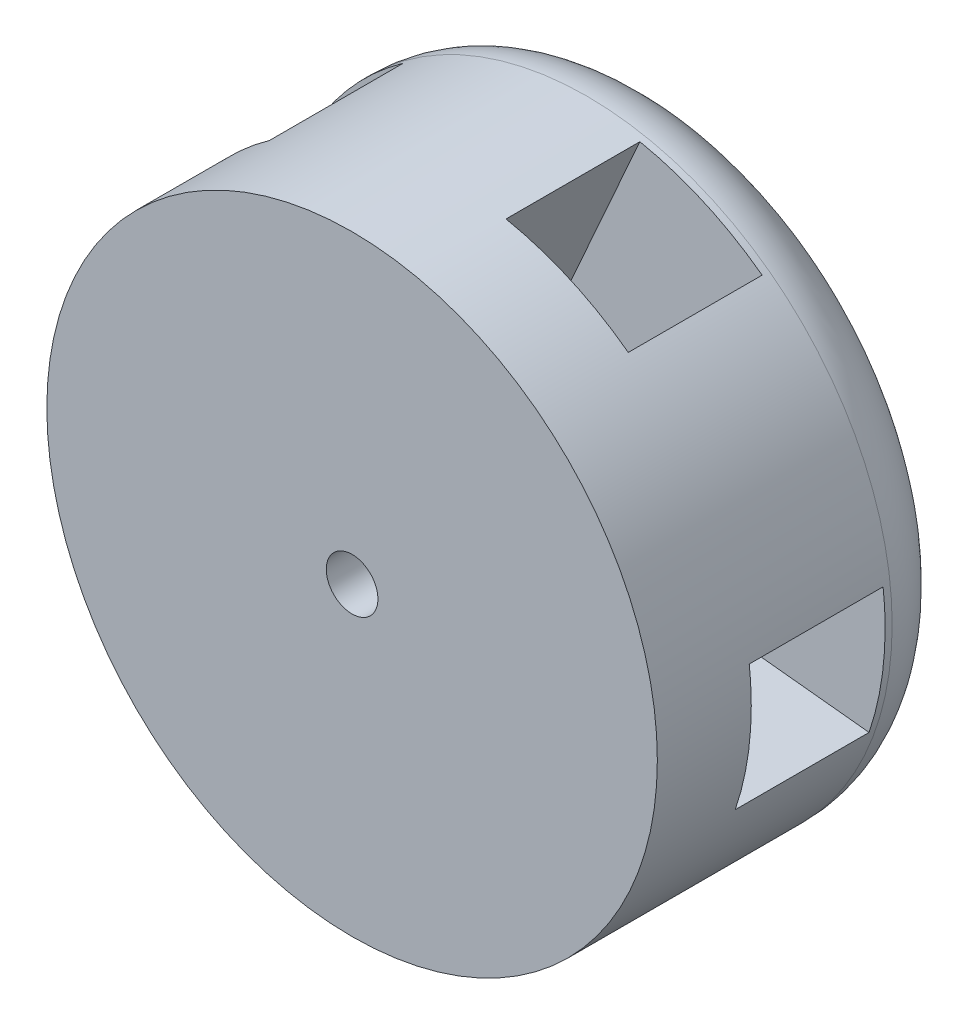
ISO-10303-21;
HEADER;
FILE_DESCRIPTION(('STEP AP214'),'2;1');
FILE_NAME('part.step','',(''),(''),'','','');
FILE_SCHEMA(('AUTOMOTIVE_DESIGN { 1 0 10303 214 1 1 1 1 }'));
ENDSEC;
DATA;
#1=APPLICATION_CONTEXT('core data for automotive mechanical design processes');
#2=APPLICATION_PROTOCOL_DEFINITION('international standard','automotive_design',2000,#1);
#3=PRODUCT_CONTEXT('',#1,'mechanical');
#4=PRODUCT('Part','Part','',(#3));
#5=PRODUCT_RELATED_PRODUCT_CATEGORY('part','',(#4));
#6=PRODUCT_DEFINITION_FORMATION('','',#4);
#7=PRODUCT_DEFINITION_CONTEXT('part definition',#1,'design');
#8=PRODUCT_DEFINITION('design','',#6,#7);
#9=PRODUCT_DEFINITION_SHAPE('','',#8);
#10=(LENGTH_UNIT() NAMED_UNIT(*) SI_UNIT(.MILLI.,.METRE.));
#11=(NAMED_UNIT(*) PLANE_ANGLE_UNIT() SI_UNIT($,.RADIAN.));
#12=(NAMED_UNIT(*) SI_UNIT($,.STERADIAN.) SOLID_ANGLE_UNIT());
#13=UNCERTAINTY_MEASURE_WITH_UNIT(LENGTH_MEASURE(1.E-05),#10,'distance_accuracy_value','');
#14=(GEOMETRIC_REPRESENTATION_CONTEXT(3) GLOBAL_UNCERTAINTY_ASSIGNED_CONTEXT((#13)) GLOBAL_UNIT_ASSIGNED_CONTEXT((#10,
#11,#12)) REPRESENTATION_CONTEXT('',''));
#15=CARTESIAN_POINT('',(0.,0.,0.));
#16=DIRECTION('',(0.,0.,1.));
#17=DIRECTION('',(1.,0.,0.));
#18=AXIS2_PLACEMENT_3D('',#15,#16,#17);
#19=CARTESIAN_POINT('',(0.,0.,10.));
#20=DIRECTION('',(0.,0.,-1.));
#21=DIRECTION('',(-1.,0.,0.));
#22=AXIS2_PLACEMENT_3D('',#19,#20,#21);
#23=CYLINDRICAL_SURFACE('',#22,13.);
#24=CARTESIAN_POINT('',(0.,0.,0.3));
#25=DIRECTION('',(0.,0.,1.));
#26=DIRECTION('',(0.,-1.,0.));
#27=AXIS2_PLACEMENT_3D('',#24,#25,#26);
#28=CIRCLE('',#27,13.);
#29=CARTESIAN_POINT('',(12.3163604187502,-4.16020023982535,0.300000000000001));
#30=VERTEX_POINT('',#29);
#31=CARTESIAN_POINT('',(12.9121726593759,1.5085745637738,0.3));
#32=VERTEX_POINT('',#31);
#33=EDGE_CURVE('E340',#30,#32,#28,.T.);
#34=ORIENTED_EDGE('',*,*,#33,.F.);
#35=DIRECTION('',(0.,0.,-1.));
#36=VECTOR('',#35,1.);
#37=CARTESIAN_POINT('',(12.3163604187502,-4.16020023982535,10.));
#38=LINE('',#37,#36);
#39=CARTESIAN_POINT('',(12.3163604187502,-4.16020023982535,6.));
#40=VERTEX_POINT('',#39);
#41=EDGE_CURVE('E345',#40,#30,#38,.T.);
#42=ORIENTED_EDGE('',*,*,#41,.F.);
#43=CARTESIAN_POINT('',(0.,0.,6.));
#44=DIRECTION('',(0.,0.,1.));
#45=DIRECTION('',(0.,-1.,0.));
#46=AXIS2_PLACEMENT_3D('',#43,#44,#45);
#47=CIRCLE('',#46,13.);
#48=CARTESIAN_POINT('',(12.9121726593759,1.5085745637738,6.));
#49=VERTEX_POINT('',#48);
#50=EDGE_CURVE('E337',#40,#49,#47,.T.);
#51=ORIENTED_EDGE('',*,*,#50,.T.);
#52=DIRECTION('',(0.,0.,-1.));
#53=VECTOR('',#52,1.);
#54=CARTESIAN_POINT('',(12.9121726593759,1.5085745637738,10.));
#55=LINE('',#54,#53);
#56=EDGE_CURVE('E342',#49,#32,#55,.T.);
#57=ORIENTED_EDGE('',*,*,#56,.T.);
#58=EDGE_LOOP('',(#34,#42,#51,#57));
#59=FACE_BOUND('',#58,.T.);
#60=CARTESIAN_POINT('',(0.,0.,0.3));
#61=DIRECTION('',(0.,0.,1.));
#62=DIRECTION('',(0.,-1.,0.));
#63=AXIS2_PLACEMENT_3D('',#60,#61,#62);
#64=CIRCLE('',#63,13.);
#65=CARTESIAN_POINT('',(-7.51884054006298,10.6050477100815,0.300000000000001));
#66=VERTEX_POINT('',#65);
#67=CARTESIAN_POINT('',(-11.3328849963085,6.3691222048604,0.3));
#68=VERTEX_POINT('',#67);
#69=EDGE_CURVE('E319',#66,#68,#64,.T.);
#70=ORIENTED_EDGE('',*,*,#69,.F.);
#71=DIRECTION('',(0.,0.,-1.));
#72=VECTOR('',#71,1.);
#73=CARTESIAN_POINT('',(-7.51884054006299,10.6050477100815,10.));
#74=LINE('',#73,#72);
#75=CARTESIAN_POINT('',(-7.51884054006298,10.6050477100815,6.));
#76=VERTEX_POINT('',#75);
#77=EDGE_CURVE('E325',#76,#66,#74,.T.);
#78=ORIENTED_EDGE('',*,*,#77,.F.);
#79=CARTESIAN_POINT('',(0.,0.,6.));
#80=DIRECTION('',(0.,0.,1.));
#81=DIRECTION('',(0.,-1.,0.));
#82=AXIS2_PLACEMENT_3D('',#79,#80,#81);
#83=CIRCLE('',#82,13.);
#84=CARTESIAN_POINT('',(-11.3328849963085,6.36912220486039,6.));
#85=VERTEX_POINT('',#84);
#86=EDGE_CURVE('E316',#76,#85,#83,.T.);
#87=ORIENTED_EDGE('',*,*,#86,.T.);
#88=DIRECTION('',(0.,0.,-1.));
#89=VECTOR('',#88,1.);
#90=CARTESIAN_POINT('',(-11.3328849963085,6.36912220486039,10.));
#91=LINE('',#90,#89);
#92=EDGE_CURVE('E322',#85,#68,#91,.T.);
#93=ORIENTED_EDGE('',*,*,#92,.T.);
#94=EDGE_LOOP('',(#70,#78,#87,#93));
#95=FACE_BOUND('',#94,.T.);
#96=CARTESIAN_POINT('',(0.,0.,10.));
#97=DIRECTION('',(0.,0.,1.));
#98=DIRECTION('',(1.,0.,0.));
#99=AXIS2_PLACEMENT_3D('',#96,#97,#98);
#100=CIRCLE('',#99,13.);
#101=CARTESIAN_POINT('',(13.,0.,10.));
#102=VERTEX_POINT('',#101);
#103=EDGE_CURVE('E293',#102,#102,#100,.T.);
#104=ORIENTED_EDGE('',*,*,#103,.F.);
#105=EDGE_LOOP('',(#104));
#106=FACE_BOUND('',#105,.T.);
#107=CARTESIAN_POINT('',(0.,0.,0.));
#108=DIRECTION('',(0.,0.,1.));
#109=DIRECTION('',(1.,0.,0.));
#110=AXIS2_PLACEMENT_3D('',#107,#108,#109);
#111=CIRCLE('',#110,13.);
#112=CARTESIAN_POINT('',(13.,0.,0.));
#113=VERTEX_POINT('',#112);
#114=EDGE_CURVE('E301',#113,#113,#111,.T.);
#115=ORIENTED_EDGE('',*,*,#114,.T.);
#116=EDGE_LOOP('',(#115));
#117=FACE_BOUND('',#116,.T.);
#118=CARTESIAN_POINT('',(0.,0.,0.3));
#119=DIRECTION('',(0.,0.,1.));
#120=DIRECTION('',(0.,-1.,0.));
#121=AXIS2_PLACEMENT_3D('',#118,#119,#120);
#122=CIRCLE('',#121,13.);
#123=CARTESIAN_POINT('',(-12.4094492351688,-3.8737023220388,0.300000000000001));
#124=VERTEX_POINT('',#123);
#125=CARTESIAN_POINT('',(-9.5594492351688,-8.8100471236101,0.3));
#126=VERTEX_POINT('',#125);
#127=EDGE_CURVE('E307',#124,#126,#122,.T.);
#128=ORIENTED_EDGE('',*,*,#127,.F.);
#129=DIRECTION('',(0.,0.,-1.));
#130=VECTOR('',#129,1.);
#131=CARTESIAN_POINT('',(-12.4094492351688,-3.8737023220388,10.));
#132=LINE('',#131,#130);
#133=CARTESIAN_POINT('',(-12.4094492351688,-3.8737023220388,6.));
#134=VERTEX_POINT('',#133);
#135=EDGE_CURVE('E313',#134,#124,#132,.T.);
#136=ORIENTED_EDGE('',*,*,#135,.F.);
#137=CARTESIAN_POINT('',(0.,0.,6.));
#138=DIRECTION('',(0.,0.,1.));
#139=DIRECTION('',(0.,-1.,0.));
#140=AXIS2_PLACEMENT_3D('',#137,#138,#139);
#141=CIRCLE('',#140,13.);
#142=CARTESIAN_POINT('',(-9.5594492351688,-8.8100471236101,6.));
#143=VERTEX_POINT('',#142);
#144=EDGE_CURVE('E304',#134,#143,#141,.T.);
#145=ORIENTED_EDGE('',*,*,#144,.T.);
#146=DIRECTION('',(0.,0.,-1.));
#147=VECTOR('',#146,1.);
#148=CARTESIAN_POINT('',(-9.5594492351688,-8.81004712361011,10.));
#149=LINE('',#148,#147);
#150=EDGE_CURVE('E310',#143,#126,#149,.T.);
#151=ORIENTED_EDGE('',*,*,#150,.T.);
#152=EDGE_LOOP('',(#128,#136,#145,#151));
#153=FACE_BOUND('',#152,.T.);
#154=CARTESIAN_POINT('',(0.,0.,0.3));
#155=DIRECTION('',(0.,0.,1.));
#156=DIRECTION('',(1.,0.,0.));
#157=AXIS2_PLACEMENT_3D('',#154,#155,#156);
#158=CIRCLE('',#157,13.);
#159=CARTESIAN_POINT('',(-0.150620868937833,-12.9991274074009,0.300000000000001));
#160=VERTEX_POINT('',#159);
#161=CARTESIAN_POINT('',(5.42482045524488,-11.8140307697397,0.3));
#162=VERTEX_POINT('',#161);
#163=EDGE_CURVE('E331',#160,#162,#158,.T.);
#164=ORIENTED_EDGE('',*,*,#163,.F.);
#165=DIRECTION('',(0.,0.,-1.));
#166=VECTOR('',#165,1.);
#167=CARTESIAN_POINT('',(-0.150620868937831,-12.9991274074009,10.));
#168=LINE('',#167,#166);
#169=CARTESIAN_POINT('',(-0.150620868937832,-12.9991274074009,6.));
#170=VERTEX_POINT('',#169);
#171=EDGE_CURVE('E196',#170,#160,#168,.T.);
#172=ORIENTED_EDGE('',*,*,#171,.F.);
#173=CARTESIAN_POINT('',(0.,0.,6.));
#174=DIRECTION('',(0.,0.,1.));
#175=DIRECTION('',(1.,0.,0.));
#176=AXIS2_PLACEMENT_3D('',#173,#174,#175);
#177=CIRCLE('',#176,13.);
#178=CARTESIAN_POINT('',(5.42482045524488,-11.8140307697397,6.));
#179=VERTEX_POINT('',#178);
#180=EDGE_CURVE('E328',#170,#179,#177,.T.);
#181=ORIENTED_EDGE('',*,*,#180,.T.);
#182=DIRECTION('',(0.,0.,-1.));
#183=VECTOR('',#182,1.);
#184=CARTESIAN_POINT('',(5.42482045524488,-11.8140307697397,10.));
#185=LINE('',#184,#183);
#186=EDGE_CURVE('E333',#179,#162,#185,.T.);
#187=ORIENTED_EDGE('',*,*,#186,.T.);
#188=EDGE_LOOP('',(#164,#172,#181,#187));
#189=FACE_BOUND('',#188,.T.);
#190=CARTESIAN_POINT('',(0.,0.,0.3));
#191=DIRECTION('',(0.,0.,1.));
#192=DIRECTION('',(1.,0.,0.));
#193=AXIS2_PLACEMENT_3D('',#190,#191,#192);
#194=CIRCLE('',#193,13.);
#195=CARTESIAN_POINT('',(7.76255022541929,10.4279822591834,0.300000000000001));
#196=VERTEX_POINT('',#195);
#197=CARTESIAN_POINT('',(2.55534111685648,12.7463811247155,0.3));
#198=VERTEX_POINT('',#197);
#199=EDGE_CURVE('E351',#196,#198,#194,.T.);
#200=ORIENTED_EDGE('',*,*,#199,.F.);
#201=DIRECTION('',(0.,0.,-1.));
#202=VECTOR('',#201,1.);
#203=CARTESIAN_POINT('',(7.76255022541929,10.4279822591834,10.));
#204=LINE('',#203,#202);
#205=CARTESIAN_POINT('',(7.76255022541929,10.4279822591834,6.));
#206=VERTEX_POINT('',#205);
#207=EDGE_CURVE('E11',#206,#196,#204,.T.);
#208=ORIENTED_EDGE('',*,*,#207,.F.);
#209=CARTESIAN_POINT('',(0.,0.,6.));
#210=DIRECTION('',(0.,0.,1.));
#211=DIRECTION('',(1.,0.,0.));
#212=AXIS2_PLACEMENT_3D('',#209,#210,#211);
#213=CIRCLE('',#212,13.);
#214=CARTESIAN_POINT('',(2.55534111685648,12.7463811247155,6.));
#215=VERTEX_POINT('',#214);
#216=EDGE_CURVE('E348',#206,#215,#213,.T.);
#217=ORIENTED_EDGE('',*,*,#216,.T.);
#218=DIRECTION('',(0.,0.,-1.));
#219=VECTOR('',#218,1.);
#220=CARTESIAN_POINT('',(2.55534111685648,12.7463811247155,10.));
#221=LINE('',#220,#219);
#222=EDGE_CURVE('E44',#215,#198,#221,.T.);
#223=ORIENTED_EDGE('',*,*,#222,.T.);
#224=EDGE_LOOP('',(#200,#208,#217,#223));
#225=FACE_BOUND('',#224,.T.);
#226=ADVANCED_FACE('F36',(#59,#95,#106,#117,#153,#189,#225),#23,.T.);
#227=CARTESIAN_POINT('',(0.,0.,0.));
#228=DIRECTION('',(0.,0.,1.));
#229=DIRECTION('',(1.,0.,0.));
#230=AXIS2_PLACEMENT_3D('',#227,#228,#229);
#231=TOROIDAL_SURFACE('',#230,10.,3.);
#232=CARTESIAN_POINT('',(0.,0.,-3.));
#233=DIRECTION('',(0.,0.,1.));
#234=DIRECTION('',(1.,0.,0.));
#235=AXIS2_PLACEMENT_3D('',#232,#233,#234);
#236=CIRCLE('',#235,10.);
#237=CARTESIAN_POINT('',(10.,0.,-3.));
#238=VERTEX_POINT('',#237);
#239=EDGE_CURVE('E296',#238,#238,#236,.F.);
#240=ORIENTED_EDGE('',*,*,#239,.F.);
#241=EDGE_LOOP('',(#240));
#242=FACE_BOUND('',#241,.T.);
#243=ORIENTED_EDGE('',*,*,#114,.F.);
#244=EDGE_LOOP('',(#243));
#245=FACE_BOUND('',#244,.T.);
#246=ADVANCED_FACE('F38',(#242,#245),#231,.T.);
#247=CARTESIAN_POINT('',(0.,0.,10.));
#248=DIRECTION('',(0.,0.,-1.));
#249=DIRECTION('',(-1.,0.,0.));
#250=AXIS2_PLACEMENT_3D('',#247,#248,#249);
#251=CYLINDRICAL_SURFACE('',#250,1.1);
#252=CARTESIAN_POINT('',(0.,0.,10.));
#253=DIRECTION('',(0.,0.,1.));
#254=DIRECTION('',(1.,0.,0.));
#255=AXIS2_PLACEMENT_3D('',#252,#253,#254);
#256=CIRCLE('',#255,1.1);
#257=CARTESIAN_POINT('',(1.1,0.,10.));
#258=VERTEX_POINT('',#257);
#259=EDGE_CURVE('E290',#258,#258,#256,.T.);
#260=ORIENTED_EDGE('',*,*,#259,.T.);
#261=EDGE_LOOP('',(#260));
#262=FACE_BOUND('',#261,.T.);
#263=CARTESIAN_POINT('',(0.,0.,0.));
#264=DIRECTION('',(0.,0.,1.));
#265=DIRECTION('',(1.,0.,0.));
#266=AXIS2_PLACEMENT_3D('',#263,#264,#265);
#267=CIRCLE('',#266,1.1);
#268=CARTESIAN_POINT('',(1.1,0.,0.));
#269=VERTEX_POINT('',#268);
#270=EDGE_CURVE('E289',#269,#269,#267,.T.);
#271=ORIENTED_EDGE('',*,*,#270,.F.);
#272=EDGE_LOOP('',(#271));
#273=FACE_BOUND('',#272,.T.);
#274=ADVANCED_FACE('F383',(#262,#273),#251,.F.);
#275=CARTESIAN_POINT('',(0.,0.,10.));
#276=DIRECTION('',(0.,0.,1.));
#277=DIRECTION('',(1.,0.,0.));
#278=AXIS2_PLACEMENT_3D('',#275,#276,#277);
#279=PLANE('',#278);
#280=ORIENTED_EDGE('',*,*,#259,.F.);
#281=EDGE_LOOP('',(#280));
#282=FACE_BOUND('',#281,.T.);
#283=ORIENTED_EDGE('',*,*,#103,.T.);
#284=EDGE_LOOP('',(#283));
#285=FACE_BOUND('',#284,.T.);
#286=ADVANCED_FACE('F387',(#282,#285),#279,.T.);
#287=CARTESIAN_POINT('',(0.,0.,0.));
#288=DIRECTION('',(0.,0.,1.));
#289=DIRECTION('',(1.,0.,0.));
#290=AXIS2_PLACEMENT_3D('',#287,#288,#289);
#291=PLANE('',#290);
#292=ORIENTED_EDGE('',*,*,#270,.T.);
#293=EDGE_LOOP('',(#292));
#294=FACE_BOUND('',#293,.T.);
#295=ADVANCED_FACE('F394',(#294),#291,.T.);
#296=CARTESIAN_POINT('',(0.,0.,-3.));
#297=DIRECTION('',(0.,0.,1.));
#298=DIRECTION('',(1.,0.,0.));
#299=AXIS2_PLACEMENT_3D('',#296,#297,#298);
#300=PLANE('',#299);
#301=ORIENTED_EDGE('',*,*,#239,.T.);
#302=EDGE_LOOP('',(#301));
#303=FACE_BOUND('',#302,.T.);
#304=ADVANCED_FACE('F401',(#303),#300,.F.);
#305=CARTESIAN_POINT('',(-2.03910161513777,-4.46817240078565,0.3));
#306=DIRECTION('',(0.,0.,1.));
#307=DIRECTION('',(0.,-1.,0.));
#308=AXIS2_PLACEMENT_3D('',#305,#306,#307);
#309=PLANE('',#308);
#310=DIRECTION('',(-0.86602540378444,-0.499999999999998,0.));
#311=VECTOR('',#310,1.);
#312=CARTESIAN_POINT('',(-4.88910161513776,0.46817240078566,0.300000000000001));
#313=LINE('',#312,#311);
#314=CARTESIAN_POINT('',(-4.88910161513776,0.46817240078566,0.300000000000001));
#315=VERTEX_POINT('',#314);
#316=EDGE_CURVE('E286',#315,#124,#313,.T.);
#317=ORIENTED_EDGE('',*,*,#316,.T.);
#318=ORIENTED_EDGE('',*,*,#127,.T.);
#319=DIRECTION('',(-0.86602540378444,-0.499999999999998,0.));
#320=VECTOR('',#319,1.);
#321=CARTESIAN_POINT('',(-2.03910161513777,-4.46817240078565,0.3));
#322=LINE('',#321,#320);
#323=CARTESIAN_POINT('',(-2.03910161513777,-4.46817240078565,0.3));
#324=VERTEX_POINT('',#323);
#325=EDGE_CURVE('E278',#324,#126,#322,.T.);
#326=ORIENTED_EDGE('',*,*,#325,.F.);
#327=DIRECTION('',(-0.499999999999998,0.86602540378444,0.));
#328=VECTOR('',#327,1.);
#329=CARTESIAN_POINT('',(-2.03910161513777,-4.46817240078565,0.3));
#330=LINE('',#329,#328);
#331=EDGE_CURVE('E267',#324,#315,#330,.T.);
#332=ORIENTED_EDGE('',*,*,#331,.T.);
#333=EDGE_LOOP('',(#317,#318,#326,#332));
#334=FACE_BOUND('',#333,.T.);
#335=ADVANCED_FACE('F405',(#334),#309,.T.);
#336=CARTESIAN_POINT('',(-4.88910161513776,0.46817240078566,0.300000000000001));
#337=DIRECTION('',(0.499999999999998,-0.86602540378444,0.));
#338=DIRECTION('',(0.86602540378444,0.499999999999998,0.));
#339=AXIS2_PLACEMENT_3D('',#336,#337,#338);
#340=PLANE('',#339);
#341=ORIENTED_EDGE('',*,*,#135,.T.);
#342=ORIENTED_EDGE('',*,*,#316,.F.);
#343=DIRECTION('',(0.,0.,1.));
#344=VECTOR('',#343,1.);
#345=CARTESIAN_POINT('',(-4.88910161513776,0.46817240078566,0.300000000000001));
#346=LINE('',#345,#344);
#347=CARTESIAN_POINT('',(-4.88910161513776,0.468172400785659,6.));
#348=VERTEX_POINT('',#347);
#349=EDGE_CURVE('E270',#315,#348,#346,.T.);
#350=ORIENTED_EDGE('',*,*,#349,.T.);
#351=DIRECTION('',(-0.86602540378444,-0.499999999999998,0.));
#352=VECTOR('',#351,1.);
#353=CARTESIAN_POINT('',(-4.88910161513776,0.468172400785659,6.));
#354=LINE('',#353,#352);
#355=EDGE_CURVE('E283',#348,#134,#354,.T.);
#356=ORIENTED_EDGE('',*,*,#355,.T.);
#357=EDGE_LOOP('',(#341,#342,#350,#356));
#358=FACE_BOUND('',#357,.T.);
#359=ADVANCED_FACE('F411',(#358),#340,.T.);
#360=CARTESIAN_POINT('',(-2.03910161513777,-4.46817240078565,6.));
#361=DIRECTION('',(0.,0.,1.));
#362=DIRECTION('',(0.,-1.,0.));
#363=AXIS2_PLACEMENT_3D('',#360,#361,#362);
#364=PLANE('',#363);
#365=ORIENTED_EDGE('',*,*,#355,.F.);
#366=DIRECTION('',(-0.499999999999998,0.86602540378444,0.));
#367=VECTOR('',#366,1.);
#368=CARTESIAN_POINT('',(-2.03910161513777,-4.46817240078565,6.));
#369=LINE('',#368,#367);
#370=CARTESIAN_POINT('',(-2.03910161513777,-4.46817240078565,6.));
#371=VERTEX_POINT('',#370);
#372=EDGE_CURVE('E272',#371,#348,#369,.T.);
#373=ORIENTED_EDGE('',*,*,#372,.F.);
#374=DIRECTION('',(-0.86602540378444,-0.499999999999998,0.));
#375=VECTOR('',#374,1.);
#376=CARTESIAN_POINT('',(-2.03910161513777,-4.46817240078565,6.));
#377=LINE('',#376,#375);
#378=EDGE_CURVE('E280',#371,#143,#377,.T.);
#379=ORIENTED_EDGE('',*,*,#378,.T.);
#380=ORIENTED_EDGE('',*,*,#144,.F.);
#381=EDGE_LOOP('',(#365,#373,#379,#380));
#382=FACE_BOUND('',#381,.T.);
#383=ADVANCED_FACE('F415',(#382),#364,.F.);
#384=CARTESIAN_POINT('',(-2.03910161513777,-4.46817240078565,0.3));
#385=DIRECTION('',(0.499999999999998,-0.86602540378444,0.));
#386=DIRECTION('',(0.86602540378444,0.499999999999998,0.));
#387=AXIS2_PLACEMENT_3D('',#384,#385,#386);
#388=PLANE('',#387);
#389=ORIENTED_EDGE('',*,*,#378,.F.);
#390=DIRECTION('',(0.,0.,1.));
#391=VECTOR('',#390,1.);
#392=CARTESIAN_POINT('',(-2.03910161513777,-4.46817240078565,0.3));
#393=LINE('',#392,#391);
#394=EDGE_CURVE('E275',#324,#371,#393,.T.);
#395=ORIENTED_EDGE('',*,*,#394,.F.);
#396=ORIENTED_EDGE('',*,*,#325,.T.);
#397=ORIENTED_EDGE('',*,*,#150,.F.);
#398=EDGE_LOOP('',(#389,#395,#396,#397));
#399=FACE_BOUND('',#398,.T.);
#400=ADVANCED_FACE('F419',(#399),#388,.F.);
#401=CARTESIAN_POINT('',(-3.46410161513776,-1.99999999999999,0.));
#402=DIRECTION('',(0.86602540378444,0.499999999999998,0.));
#403=DIRECTION('',(-0.499999999999998,0.86602540378444,0.));
#404=AXIS2_PLACEMENT_3D('',#401,#402,#403);
#405=PLANE('',#404);
#406=ORIENTED_EDGE('',*,*,#331,.F.);
#407=ORIENTED_EDGE('',*,*,#394,.T.);
#408=ORIENTED_EDGE('',*,*,#372,.T.);
#409=ORIENTED_EDGE('',*,*,#349,.F.);
#410=EDGE_LOOP('',(#406,#407,#408,#409));
#411=FACE_BOUND('',#410,.T.);
#412=ADVANCED_FACE('F423',(#411),#405,.F.);
#413=CARTESIAN_POINT('',(-4.87960153003233,0.558559672824886,0.3));
#414=DIRECTION('',(0.,0.,1.));
#415=DIRECTION('',(0.,-1.,0.));
#416=AXIS2_PLACEMENT_3D('',#413,#414,#415);
#417=PLANE('',#416);
#418=DIRECTION('',(-0.743144825477391,0.669130606358862,0.));
#419=VECTOR('',#418,1.);
#420=CARTESIAN_POINT('',(-1.06555707378681,4.79448517804602,0.300000000000001));
#421=LINE('',#420,#419);
#422=CARTESIAN_POINT('',(-1.06555707378681,4.79448517804602,0.300000000000001));
#423=VERTEX_POINT('',#422);
#424=EDGE_CURVE('E264',#423,#66,#421,.T.);
#425=ORIENTED_EDGE('',*,*,#424,.T.);
#426=ORIENTED_EDGE('',*,*,#69,.T.);
#427=DIRECTION('',(-0.743144825477391,0.669130606358862,0.));
#428=VECTOR('',#427,1.);
#429=CARTESIAN_POINT('',(-4.87960153003233,0.558559672824886,0.3));
#430=LINE('',#429,#428);
#431=CARTESIAN_POINT('',(-4.87960153003233,0.558559672824886,0.3));
#432=VERTEX_POINT('',#431);
#433=EDGE_CURVE('E256',#432,#68,#430,.T.);
#434=ORIENTED_EDGE('',*,*,#433,.F.);
#435=DIRECTION('',(0.669130606358862,0.743144825477391,0.));
#436=VECTOR('',#435,1.);
#437=CARTESIAN_POINT('',(-4.87960153003233,0.558559672824886,0.3));
#438=LINE('',#437,#436);
#439=EDGE_CURVE('E228',#432,#423,#438,.T.);
#440=ORIENTED_EDGE('',*,*,#439,.T.);
#441=EDGE_LOOP('',(#425,#426,#434,#440));
#442=FACE_BOUND('',#441,.T.);
#443=ADVANCED_FACE('F427',(#442),#417,.T.);
#444=CARTESIAN_POINT('',(-1.06555707378681,4.79448517804602,0.300000000000001));
#445=DIRECTION('',(-0.669130606358862,-0.743144825477391,0.));
#446=DIRECTION('',(0.743144825477391,-0.669130606358862,0.));
#447=AXIS2_PLACEMENT_3D('',#444,#445,#446);
#448=PLANE('',#447);
#449=ORIENTED_EDGE('',*,*,#77,.T.);
#450=ORIENTED_EDGE('',*,*,#424,.F.);
#451=DIRECTION('',(0.,0.,1.));
#452=VECTOR('',#451,1.);
#453=CARTESIAN_POINT('',(-1.06555707378681,4.79448517804602,0.300000000000001));
#454=LINE('',#453,#452);
#455=CARTESIAN_POINT('',(-1.06555707378681,4.79448517804602,6.));
#456=VERTEX_POINT('',#455);
#457=EDGE_CURVE('E248',#423,#456,#454,.T.);
#458=ORIENTED_EDGE('',*,*,#457,.T.);
#459=DIRECTION('',(-0.743144825477391,0.669130606358862,0.));
#460=VECTOR('',#459,1.);
#461=CARTESIAN_POINT('',(-1.06555707378681,4.79448517804602,6.));
#462=LINE('',#461,#460);
#463=EDGE_CURVE('E261',#456,#76,#462,.T.);
#464=ORIENTED_EDGE('',*,*,#463,.T.);
#465=EDGE_LOOP('',(#449,#450,#458,#464));
#466=FACE_BOUND('',#465,.T.);
#467=ADVANCED_FACE('F431',(#466),#448,.T.);
#468=CARTESIAN_POINT('',(-4.87960153003233,0.558559672824885,6.));
#469=DIRECTION('',(0.,0.,1.));
#470=DIRECTION('',(0.,-1.,0.));
#471=AXIS2_PLACEMENT_3D('',#468,#469,#470);
#472=PLANE('',#471);
#473=ORIENTED_EDGE('',*,*,#463,.F.);
#474=DIRECTION('',(0.669130606358862,0.743144825477391,0.));
#475=VECTOR('',#474,1.);
#476=CARTESIAN_POINT('',(-4.87960153003233,0.558559672824885,6.));
#477=LINE('',#476,#475);
#478=CARTESIAN_POINT('',(-4.87960153003233,0.558559672824885,6.));
#479=VERTEX_POINT('',#478);
#480=EDGE_CURVE('E250',#479,#456,#477,.T.);
#481=ORIENTED_EDGE('',*,*,#480,.F.);
#482=DIRECTION('',(-0.743144825477391,0.669130606358862,0.));
#483=VECTOR('',#482,1.);
#484=CARTESIAN_POINT('',(-4.87960153003233,0.558559672824885,6.));
#485=LINE('',#484,#483);
#486=EDGE_CURVE('E258',#479,#85,#485,.T.);
#487=ORIENTED_EDGE('',*,*,#486,.T.);
#488=ORIENTED_EDGE('',*,*,#86,.F.);
#489=EDGE_LOOP('',(#473,#481,#487,#488));
#490=FACE_BOUND('',#489,.T.);
#491=ADVANCED_FACE('F435',(#490),#472,.F.);
#492=CARTESIAN_POINT('',(-4.87960153003233,0.558559672824886,0.3));
#493=DIRECTION('',(-0.669130606358862,-0.743144825477391,0.));
#494=DIRECTION('',(0.743144825477391,-0.669130606358862,0.));
#495=AXIS2_PLACEMENT_3D('',#492,#493,#494);
#496=PLANE('',#495);
#497=ORIENTED_EDGE('',*,*,#486,.F.);
#498=DIRECTION('',(0.,0.,1.));
#499=VECTOR('',#498,1.);
#500=CARTESIAN_POINT('',(-4.87960153003233,0.558559672824886,0.3));
#501=LINE('',#500,#499);
#502=EDGE_CURVE('E253',#432,#479,#501,.T.);
#503=ORIENTED_EDGE('',*,*,#502,.F.);
#504=ORIENTED_EDGE('',*,*,#433,.T.);
#505=ORIENTED_EDGE('',*,*,#92,.F.);
#506=EDGE_LOOP('',(#497,#503,#504,#505));
#507=FACE_BOUND('',#506,.T.);
#508=ADVANCED_FACE('F439',(#507),#496,.F.);
#509=CARTESIAN_POINT('',(-2.97257930190957,2.67652242543545,0.));
#510=DIRECTION('',(0.743144825477391,-0.669130606358862,0.));
#511=DIRECTION('',(0.669130606358862,0.743144825477391,0.));
#512=AXIS2_PLACEMENT_3D('',#509,#510,#511);
#513=PLANE('',#512);
#514=ORIENTED_EDGE('',*,*,#439,.F.);
#515=ORIENTED_EDGE('',*,*,#502,.T.);
#516=ORIENTED_EDGE('',*,*,#480,.T.);
#517=ORIENTED_EDGE('',*,*,#457,.F.);
#518=EDGE_LOOP('',(#514,#515,#516,#517));
#519=FACE_BOUND('',#518,.T.);
#520=ADVANCED_FACE('F443',(#519),#513,.F.);
#521=CARTESIAN_POINT('',(3.61936742536234,-3.32004208410466,0.3));
#522=DIRECTION('',(0.,0.,1.));
#523=DIRECTION('',(1.,0.,0.));
#524=AXIS2_PLACEMENT_3D('',#521,#522,#523);
#525=PLANE('',#524);
#526=DIRECTION('',(0.207911690817746,-0.978147600733808,0.));
#527=VECTOR('',#526,1.);
#528=CARTESIAN_POINT('',(-1.95607389882037,-4.50513872176581,0.300000000000001));
#529=LINE('',#528,#527);
#530=CARTESIAN_POINT('',(-1.95607389882037,-4.50513872176581,0.300000000000001));
#531=VERTEX_POINT('',#530);
#532=EDGE_CURVE('E190',#531,#160,#529,.T.);
#533=ORIENTED_EDGE('',*,*,#532,.T.);
#534=ORIENTED_EDGE('',*,*,#163,.T.);
#535=DIRECTION('',(0.207911690817746,-0.978147600733808,0.));
#536=VECTOR('',#535,1.);
#537=CARTESIAN_POINT('',(3.61936742536234,-3.32004208410466,0.3));
#538=LINE('',#537,#536);
#539=CARTESIAN_POINT('',(3.61936742536234,-3.32004208410466,0.3));
#540=VERTEX_POINT('',#539);
#541=EDGE_CURVE('E191',#540,#162,#538,.T.);
#542=ORIENTED_EDGE('',*,*,#541,.F.);
#543=DIRECTION('',(-0.978147600733809,-0.207911690817746,0.));
#544=VECTOR('',#543,1.);
#545=CARTESIAN_POINT('',(3.61936742536234,-3.32004208410466,0.3));
#546=LINE('',#545,#544);
#547=EDGE_CURVE('E177',#540,#531,#546,.T.);
#548=ORIENTED_EDGE('',*,*,#547,.T.);
#549=EDGE_LOOP('',(#533,#534,#542,#548));
#550=FACE_BOUND('',#549,.T.);
#551=ADVANCED_FACE('F188',(#550),#525,.T.);
#552=CARTESIAN_POINT('',(-1.95607389882037,-4.50513872176581,0.300000000000001));
#553=DIRECTION('',(0.978147600733808,0.207911690817746,0.));
#554=DIRECTION('',(-0.207911690817746,0.978147600733809,0.));
#555=AXIS2_PLACEMENT_3D('',#552,#553,#554);
#556=PLANE('',#555);
#557=ORIENTED_EDGE('',*,*,#171,.T.);
#558=ORIENTED_EDGE('',*,*,#532,.F.);
#559=DIRECTION('',(0.,0.,1.));
#560=VECTOR('',#559,1.);
#561=CARTESIAN_POINT('',(-1.95607389882037,-4.50513872176581,0.300000000000001));
#562=LINE('',#561,#560);
#563=CARTESIAN_POINT('',(-1.95607389882037,-4.50513872176581,6.));
#564=VERTEX_POINT('',#563);
#565=EDGE_CURVE('E173',#531,#564,#562,.T.);
#566=ORIENTED_EDGE('',*,*,#565,.T.);
#567=DIRECTION('',(0.207911690817746,-0.978147600733808,0.));
#568=VECTOR('',#567,1.);
#569=CARTESIAN_POINT('',(-1.95607389882037,-4.50513872176581,6.));
#570=LINE('',#569,#568);
#571=EDGE_CURVE('E198',#564,#170,#570,.T.);
#572=ORIENTED_EDGE('',*,*,#571,.T.);
#573=EDGE_LOOP('',(#557,#558,#566,#572));
#574=FACE_BOUND('',#573,.T.);
#575=ADVANCED_FACE('F194',(#574),#556,.T.);
#576=CARTESIAN_POINT('',(3.61936742536234,-3.32004208410466,6.));
#577=DIRECTION('',(0.,0.,1.));
#578=DIRECTION('',(1.,0.,0.));
#579=AXIS2_PLACEMENT_3D('',#576,#577,#578);
#580=PLANE('',#579);
#581=ORIENTED_EDGE('',*,*,#571,.F.);
#582=DIRECTION('',(-0.978147600733808,-0.207911690817746,0.));
#583=VECTOR('',#582,1.);
#584=CARTESIAN_POINT('',(3.61936742536234,-3.32004208410466,6.));
#585=LINE('',#584,#583);
#586=CARTESIAN_POINT('',(3.61936742536234,-3.32004208410466,6.));
#587=VERTEX_POINT('',#586);
#588=EDGE_CURVE('E180',#587,#564,#585,.T.);
#589=ORIENTED_EDGE('',*,*,#588,.F.);
#590=DIRECTION('',(0.207911690817746,-0.978147600733808,0.));
#591=VECTOR('',#590,1.);
#592=CARTESIAN_POINT('',(3.61936742536234,-3.32004208410466,6.));
#593=LINE('',#592,#591);
#594=EDGE_CURVE('E203',#587,#179,#593,.T.);
#595=ORIENTED_EDGE('',*,*,#594,.T.);
#596=ORIENTED_EDGE('',*,*,#180,.F.);
#597=EDGE_LOOP('',(#581,#589,#595,#596));
#598=FACE_BOUND('',#597,.T.);
#599=ADVANCED_FACE('F513',(#598),#580,.F.);
#600=CARTESIAN_POINT('',(3.61936742536234,-3.32004208410466,0.3));
#601=DIRECTION('',(0.978147600733808,0.207911690817746,0.));
#602=DIRECTION('',(-0.207911690817746,0.978147600733809,0.));
#603=AXIS2_PLACEMENT_3D('',#600,#601,#602);
#604=PLANE('',#603);
#605=ORIENTED_EDGE('',*,*,#594,.F.);
#606=DIRECTION('',(0.,0.,1.));
#607=VECTOR('',#606,1.);
#608=CARTESIAN_POINT('',(3.61936742536234,-3.32004208410466,0.3));
#609=LINE('',#608,#607);
#610=EDGE_CURVE('E676',#540,#587,#609,.T.);
#611=ORIENTED_EDGE('',*,*,#610,.F.);
#612=ORIENTED_EDGE('',*,*,#541,.T.);
#613=ORIENTED_EDGE('',*,*,#186,.F.);
#614=EDGE_LOOP('',(#605,#611,#612,#613));
#615=FACE_BOUND('',#614,.T.);
#616=ADVANCED_FACE('F516',(#615),#604,.F.);
#617=CARTESIAN_POINT('',(0.831646763270983,-3.91259040293524,0.));
#618=DIRECTION('',(-0.207911690817746,0.978147600733809,0.));
#619=DIRECTION('',(-0.978147600733809,-0.207911690817746,0.));
#620=AXIS2_PLACEMENT_3D('',#617,#618,#619);
#621=PLANE('',#620);
#622=ORIENTED_EDGE('',*,*,#547,.F.);
#623=ORIENTED_EDGE('',*,*,#610,.T.);
#624=ORIENTED_EDGE('',*,*,#588,.T.);
#625=ORIENTED_EDGE('',*,*,#565,.F.);
#626=EDGE_LOOP('',(#622,#623,#624,#625));
#627=FACE_BOUND('',#626,.T.);
#628=ADVANCED_FACE('F175',(#627),#621,.F.);
#629=CARTESIAN_POINT('',(4.27599370178593,2.41627354872892,0.3));
#630=DIRECTION('',(0.,0.,1.));
#631=DIRECTION('',(0.,-1.,0.));
#632=AXIS2_PLACEMENT_3D('',#629,#630,#631);
#633=PLANE('',#632);
#634=DIRECTION('',(0.994521895368272,-0.104528463267665,0.));
#635=VECTOR('',#634,1.);
#636=CARTESIAN_POINT('',(3.68018146116025,-3.25250125487023,0.300000000000001));
#637=LINE('',#636,#635);
#638=CARTESIAN_POINT('',(3.68018146116025,-3.25250125487023,0.300000000000001));
#639=VERTEX_POINT('',#638);
#640=EDGE_CURVE('E211',#639,#30,#637,.T.);
#641=ORIENTED_EDGE('',*,*,#640,.T.);
#642=ORIENTED_EDGE('',*,*,#33,.T.);
#643=DIRECTION('',(0.994521895368272,-0.104528463267665,0.));
#644=VECTOR('',#643,1.);
#645=CARTESIAN_POINT('',(4.27599370178593,2.41627354872892,0.3));
#646=LINE('',#645,#644);
#647=CARTESIAN_POINT('',(4.27599370178593,2.41627354872892,0.3));
#648=VERTEX_POINT('',#647);
#649=EDGE_CURVE('E59',#648,#32,#646,.T.);
#650=ORIENTED_EDGE('',*,*,#649,.F.);
#651=DIRECTION('',(-0.104528463267665,-0.994521895368272,0.));
#652=VECTOR('',#651,1.);
#653=CARTESIAN_POINT('',(4.27599370178593,2.41627354872892,0.3));
#654=LINE('',#653,#652);
#655=EDGE_CURVE('E197',#648,#639,#654,.T.);
#656=ORIENTED_EDGE('',*,*,#655,.T.);
#657=EDGE_LOOP('',(#641,#642,#650,#656));
#658=FACE_BOUND('',#657,.T.);
#659=ADVANCED_FACE('F448',(#658),#633,.T.);
#660=CARTESIAN_POINT('',(3.68018146116025,-3.25250125487023,0.300000000000001));
#661=DIRECTION('',(0.104528463267665,0.994521895368272,0.));
#662=DIRECTION('',(-0.994521895368272,0.104528463267665,0.));
#663=AXIS2_PLACEMENT_3D('',#660,#661,#662);
#664=PLANE('',#663);
#665=ORIENTED_EDGE('',*,*,#41,.T.);
#666=ORIENTED_EDGE('',*,*,#640,.F.);
#667=DIRECTION('',(0.,0.,1.));
#668=VECTOR('',#667,1.);
#669=CARTESIAN_POINT('',(3.68018146116025,-3.25250125487023,0.300000000000001));
#670=LINE('',#669,#668);
#671=CARTESIAN_POINT('',(3.68018146116025,-3.25250125487023,6.));
#672=VERTEX_POINT('',#671);
#673=EDGE_CURVE('E201',#639,#672,#670,.T.);
#674=ORIENTED_EDGE('',*,*,#673,.T.);
#675=DIRECTION('',(0.994521895368272,-0.104528463267665,0.));
#676=VECTOR('',#675,1.);
#677=CARTESIAN_POINT('',(3.68018146116025,-3.25250125487023,6.));
#678=LINE('',#677,#676);
#679=EDGE_CURVE('E241',#672,#40,#678,.T.);
#680=ORIENTED_EDGE('',*,*,#679,.T.);
#681=EDGE_LOOP('',(#665,#666,#674,#680));
#682=FACE_BOUND('',#681,.T.);
#683=ADVANCED_FACE('F451',(#682),#664,.T.);
#684=CARTESIAN_POINT('',(4.27599370178594,2.41627354872892,6.));
#685=DIRECTION('',(0.,0.,1.));
#686=DIRECTION('',(0.,-1.,0.));
#687=AXIS2_PLACEMENT_3D('',#684,#685,#686);
#688=PLANE('',#687);
#689=ORIENTED_EDGE('',*,*,#679,.F.);
#690=DIRECTION('',(-0.104528463267664,-0.994521895368272,0.));
#691=VECTOR('',#690,1.);
#692=CARTESIAN_POINT('',(4.27599370178594,2.41627354872892,6.));
#693=LINE('',#692,#691);
#694=CARTESIAN_POINT('',(4.27599370178594,2.41627354872892,6.));
#695=VERTEX_POINT('',#694);
#696=EDGE_CURVE('E231',#695,#672,#693,.T.);
#697=ORIENTED_EDGE('',*,*,#696,.F.);
#698=DIRECTION('',(0.994521895368272,-0.104528463267665,0.));
#699=VECTOR('',#698,1.);
#700=CARTESIAN_POINT('',(4.27599370178594,2.41627354872892,6.));
#701=LINE('',#700,#699);
#702=EDGE_CURVE('E238',#695,#49,#701,.T.);
#703=ORIENTED_EDGE('',*,*,#702,.T.);
#704=ORIENTED_EDGE('',*,*,#50,.F.);
#705=EDGE_LOOP('',(#689,#697,#703,#704));
#706=FACE_BOUND('',#705,.T.);
#707=ADVANCED_FACE('F455',(#706),#688,.F.);
#708=CARTESIAN_POINT('',(4.27599370178593,2.41627354872892,0.3));
#709=DIRECTION('',(0.104528463267665,0.994521895368272,0.));
#710=DIRECTION('',(-0.994521895368272,0.104528463267665,0.));
#711=AXIS2_PLACEMENT_3D('',#708,#709,#710);
#712=PLANE('',#711);
#713=ORIENTED_EDGE('',*,*,#702,.F.);
#714=DIRECTION('',(0.,0.,1.));
#715=VECTOR('',#714,1.);
#716=CARTESIAN_POINT('',(4.27599370178593,2.41627354872892,0.3));
#717=LINE('',#716,#715);
#718=EDGE_CURVE('E234',#648,#695,#717,.T.);
#719=ORIENTED_EDGE('',*,*,#718,.F.);
#720=ORIENTED_EDGE('',*,*,#649,.T.);
#721=ORIENTED_EDGE('',*,*,#56,.F.);
#722=EDGE_LOOP('',(#713,#719,#720,#721));
#723=FACE_BOUND('',#722,.T.);
#724=ADVANCED_FACE('F459',(#723),#712,.F.);
#725=CARTESIAN_POINT('',(3.97808758147309,-0.41811385307066,0.));
#726=DIRECTION('',(-0.994521895368272,0.104528463267665,0.));
#727=DIRECTION('',(-0.104528463267665,-0.994521895368272,0.));
#728=AXIS2_PLACEMENT_3D('',#725,#726,#727);
#729=PLANE('',#728);
#730=ORIENTED_EDGE('',*,*,#655,.F.);
#731=ORIENTED_EDGE('',*,*,#718,.T.);
#732=ORIENTED_EDGE('',*,*,#696,.T.);
#733=ORIENTED_EDGE('',*,*,#673,.F.);
#734=EDGE_LOOP('',(#730,#731,#732,#733));
#735=FACE_BOUND('',#734,.T.);
#736=ADVANCED_FACE('F375',(#735),#729,.F.);
#737=CARTESIAN_POINT('',(-0.976657981978172,4.81338126333644,0.3));
#738=DIRECTION('',(0.,0.,1.));
#739=DIRECTION('',(1.,0.,0.));
#740=AXIS2_PLACEMENT_3D('',#737,#738,#739);
#741=PLANE('',#740);
#742=DIRECTION('',(0.406736643075807,0.913545457642598,0.));
#743=VECTOR('',#742,1.);
#744=CARTESIAN_POINT('',(4.23055112658463,2.49498239780434,0.300000000000001));
#745=LINE('',#744,#743);
#746=CARTESIAN_POINT('',(4.23055112658463,2.49498239780434,0.300000000000001));
#747=VERTEX_POINT('',#746);
#748=EDGE_CURVE('E226',#747,#196,#745,.T.);
#749=ORIENTED_EDGE('',*,*,#748,.T.);
#750=ORIENTED_EDGE('',*,*,#199,.T.);
#751=DIRECTION('',(0.406736643075807,0.913545457642598,0.));
#752=VECTOR('',#751,1.);
#753=CARTESIAN_POINT('',(-0.976657981978172,4.81338126333644,0.3));
#754=LINE('',#753,#752);
#755=CARTESIAN_POINT('',(-0.976657981978172,4.81338126333644,0.3));
#756=VERTEX_POINT('',#755);
#757=EDGE_CURVE('E51',#756,#198,#754,.T.);
#758=ORIENTED_EDGE('',*,*,#757,.F.);
#759=DIRECTION('',(0.913545457642598,-0.406736643075808,0.));
#760=VECTOR('',#759,1.);
#761=CARTESIAN_POINT('',(-0.976657981978172,4.81338126333644,0.3));
#762=LINE('',#761,#760);
#763=EDGE_CURVE('E207',#756,#747,#762,.T.);
#764=ORIENTED_EDGE('',*,*,#763,.T.);
#765=EDGE_LOOP('',(#749,#750,#758,#764));
#766=FACE_BOUND('',#765,.T.);
#767=ADVANCED_FACE('F365',(#766),#741,.T.);
#768=CARTESIAN_POINT('',(4.23055112658463,2.49498239780434,0.300000000000001));
#769=DIRECTION('',(-0.913545457642598,0.406736643075807,0.));
#770=DIRECTION('',(-0.406736643075808,-0.913545457642598,0.));
#771=AXIS2_PLACEMENT_3D('',#768,#769,#770);
#772=PLANE('',#771);
#773=ORIENTED_EDGE('',*,*,#207,.T.);
#774=ORIENTED_EDGE('',*,*,#748,.F.);
#775=DIRECTION('',(0.,0.,1.));
#776=VECTOR('',#775,1.);
#777=CARTESIAN_POINT('',(4.23055112658463,2.49498239780434,0.300000000000001));
#778=LINE('',#777,#776);
#779=CARTESIAN_POINT('',(4.23055112658463,2.49498239780434,6.));
#780=VERTEX_POINT('',#779);
#781=EDGE_CURVE('E210',#747,#780,#778,.T.);
#782=ORIENTED_EDGE('',*,*,#781,.T.);
#783=DIRECTION('',(0.406736643075807,0.913545457642598,0.));
#784=VECTOR('',#783,1.);
#785=CARTESIAN_POINT('',(4.23055112658463,2.49498239780434,6.));
#786=LINE('',#785,#784);
#787=EDGE_CURVE('E223',#780,#206,#786,.T.);
#788=ORIENTED_EDGE('',*,*,#787,.T.);
#789=EDGE_LOOP('',(#773,#774,#782,#788));
#790=FACE_BOUND('',#789,.T.);
#791=ADVANCED_FACE('F367',(#790),#772,.T.);
#792=CARTESIAN_POINT('',(-0.976657981978176,4.81338126333644,6.));
#793=DIRECTION('',(0.,0.,1.));
#794=DIRECTION('',(1.,0.,0.));
#795=AXIS2_PLACEMENT_3D('',#792,#793,#794);
#796=PLANE('',#795);
#797=ORIENTED_EDGE('',*,*,#787,.F.);
#798=DIRECTION('',(0.913545457642598,-0.406736643075807,0.));
#799=VECTOR('',#798,1.);
#800=CARTESIAN_POINT('',(-0.976657981978176,4.81338126333644,6.));
#801=LINE('',#800,#799);
#802=CARTESIAN_POINT('',(-0.976657981978176,4.81338126333644,6.));
#803=VERTEX_POINT('',#802);
#804=EDGE_CURVE('E213',#803,#780,#801,.T.);
#805=ORIENTED_EDGE('',*,*,#804,.F.);
#806=DIRECTION('',(0.406736643075807,0.913545457642598,0.));
#807=VECTOR('',#806,1.);
#808=CARTESIAN_POINT('',(-0.976657981978176,4.81338126333644,6.));
#809=LINE('',#808,#807);
#810=EDGE_CURVE('E220',#803,#215,#809,.T.);
#811=ORIENTED_EDGE('',*,*,#810,.T.);
#812=ORIENTED_EDGE('',*,*,#216,.F.);
#813=EDGE_LOOP('',(#797,#805,#811,#812));
#814=FACE_BOUND('',#813,.T.);
#815=ADVANCED_FACE('F359',(#814),#796,.F.);
#816=CARTESIAN_POINT('',(-0.976657981978172,4.81338126333644,0.3));
#817=DIRECTION('',(-0.913545457642598,0.406736643075807,0.));
#818=DIRECTION('',(-0.406736643075808,-0.913545457642598,0.));
#819=AXIS2_PLACEMENT_3D('',#816,#817,#818);
#820=PLANE('',#819);
#821=ORIENTED_EDGE('',*,*,#810,.F.);
#822=DIRECTION('',(0.,0.,1.));
#823=VECTOR('',#822,1.);
#824=CARTESIAN_POINT('',(-0.976657981978172,4.81338126333644,0.3));
#825=LINE('',#824,#823);
#826=EDGE_CURVE('E216',#756,#803,#825,.T.);
#827=ORIENTED_EDGE('',*,*,#826,.F.);
#828=ORIENTED_EDGE('',*,*,#757,.T.);
#829=ORIENTED_EDGE('',*,*,#222,.F.);
#830=EDGE_LOOP('',(#821,#827,#828,#829));
#831=FACE_BOUND('',#830,.T.);
#832=ADVANCED_FACE('F355',(#831),#820,.F.);
#833=CARTESIAN_POINT('',(1.62694657230323,3.6541818305704,0.));
#834=DIRECTION('',(-0.406736643075808,-0.913545457642598,0.));
#835=DIRECTION('',(0.913545457642598,-0.406736643075808,0.));
#836=AXIS2_PLACEMENT_3D('',#833,#834,#835);
#837=PLANE('',#836);
#838=ORIENTED_EDGE('',*,*,#763,.F.);
#839=ORIENTED_EDGE('',*,*,#826,.T.);
#840=ORIENTED_EDGE('',*,*,#804,.T.);
#841=ORIENTED_EDGE('',*,*,#781,.F.);
#842=EDGE_LOOP('',(#838,#839,#840,#841));
#843=FACE_BOUND('',#842,.T.);
#844=ADVANCED_FACE('F362',(#843),#837,.F.);
#845=CLOSED_SHELL('',(#226,#246,#274,#286,#295,#304,#335,#359,#383,#400,#412,#443,#467,#491,
#508,#520,#551,#575,#599,#616,#628,#659,#683,#707,#724,#736,#767,#791,#815,#832,#844));
#846=MANIFOLD_SOLID_BREP('B2',#845);
#847=ADVANCED_BREP_SHAPE_REPRESENTATION('',(#18,#846),#14);
#848=SHAPE_DEFINITION_REPRESENTATION(#9,#847);
ENDSEC;
END-ISO-10303-21;
